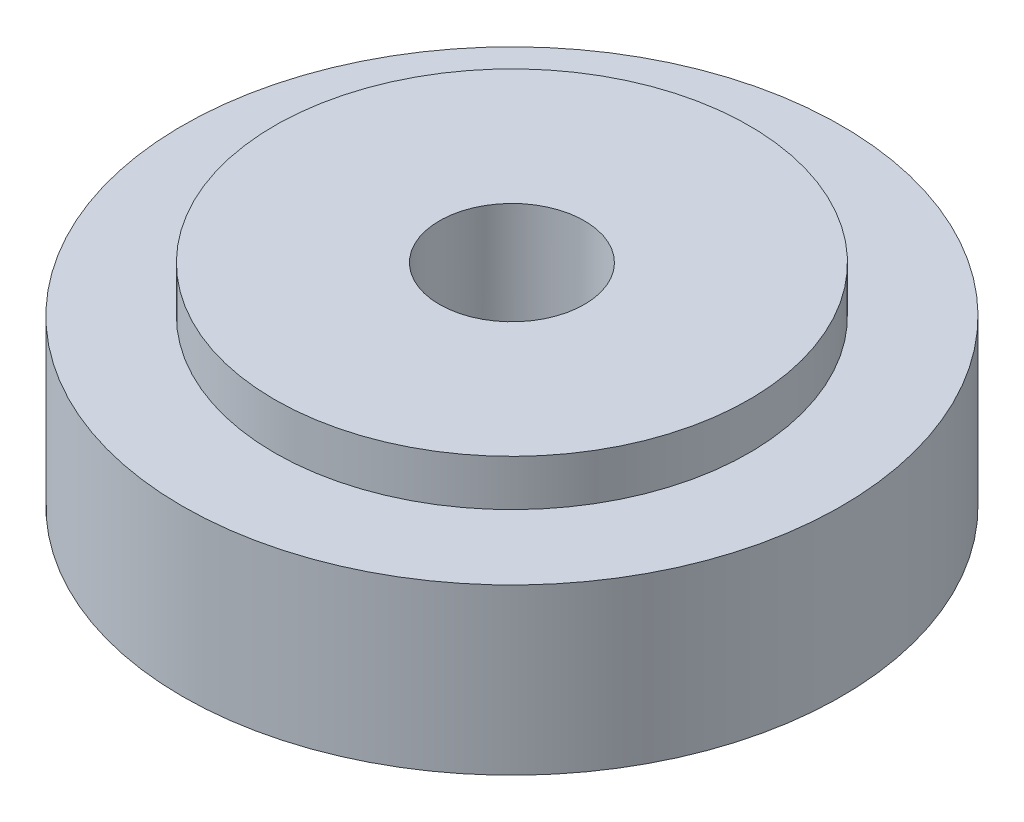
ISO-10303-21;
HEADER;
FILE_DESCRIPTION(('STEP AP214'),'2;1');
FILE_NAME('part.step','',(''),(''),'','','');
FILE_SCHEMA(('AUTOMOTIVE_DESIGN { 1 0 10303 214 1 1 1 1 }'));
ENDSEC;
DATA;
#1=APPLICATION_CONTEXT('core data for automotive mechanical design processes');
#2=APPLICATION_PROTOCOL_DEFINITION('international standard','automotive_design',2000,#1);
#3=PRODUCT_CONTEXT('',#1,'mechanical');
#4=PRODUCT('Part','Part','',(#3));
#5=PRODUCT_RELATED_PRODUCT_CATEGORY('part','',(#4));
#6=PRODUCT_DEFINITION_FORMATION('','',#4);
#7=PRODUCT_DEFINITION_CONTEXT('part definition',#1,'design');
#8=PRODUCT_DEFINITION('design','',#6,#7);
#9=PRODUCT_DEFINITION_SHAPE('','',#8);
#10=(LENGTH_UNIT() NAMED_UNIT(*) SI_UNIT(.MILLI.,.METRE.));
#11=(NAMED_UNIT(*) PLANE_ANGLE_UNIT() SI_UNIT($,.RADIAN.));
#12=(NAMED_UNIT(*) SI_UNIT($,.STERADIAN.) SOLID_ANGLE_UNIT());
#13=UNCERTAINTY_MEASURE_WITH_UNIT(LENGTH_MEASURE(1.E-05),#10,'distance_accuracy_value','');
#14=(GEOMETRIC_REPRESENTATION_CONTEXT(3) GLOBAL_UNCERTAINTY_ASSIGNED_CONTEXT((#13)) GLOBAL_UNIT_ASSIGNED_CONTEXT((#10,
#11,#12)) REPRESENTATION_CONTEXT('',''));
#15=CARTESIAN_POINT('',(0.,0.,0.));
#16=DIRECTION('',(0.,0.,1.));
#17=DIRECTION('',(1.,0.,0.));
#18=AXIS2_PLACEMENT_3D('',#15,#16,#17);
#19=CARTESIAN_POINT('',(0.,0.,0.));
#20=DIRECTION('',(0.,1.,0.));
#21=DIRECTION('',(0.,0.,1.));
#22=AXIS2_PLACEMENT_3D('',#19,#20,#21);
#23=CYLINDRICAL_SURFACE('',#22,1.1);
#24=CARTESIAN_POINT('',(0.,3.2,0.));
#25=DIRECTION('',(0.,1.,0.));
#26=DIRECTION('',(0.,0.,1.));
#27=AXIS2_PLACEMENT_3D('',#24,#25,#26);
#28=CIRCLE('',#27,1.1);
#29=CARTESIAN_POINT('',(0.,3.2,1.1));
#30=VERTEX_POINT('',#29);
#31=EDGE_CURVE('E55',#30,#30,#28,.T.);
#32=ORIENTED_EDGE('',*,*,#31,.T.);
#33=EDGE_LOOP('',(#32));
#34=FACE_BOUND('',#33,.T.);
#35=CARTESIAN_POINT('',(0.,1.,0.));
#36=DIRECTION('',(0.,-1.,0.));
#37=DIRECTION('',(0.,0.,-1.));
#38=AXIS2_PLACEMENT_3D('',#35,#36,#37);
#39=CIRCLE('',#38,1.1);
#40=CARTESIAN_POINT('',(0.,1.,-1.1));
#41=VERTEX_POINT('',#40);
#42=EDGE_CURVE('E37',#41,#41,#39,.F.);
#43=ORIENTED_EDGE('',*,*,#42,.F.);
#44=EDGE_LOOP('',(#43));
#45=FACE_BOUND('',#44,.T.);
#46=ADVANCED_FACE('F33',(#34,#45),#23,.F.);
#47=CARTESIAN_POINT('',(0.,2.5,0.));
#48=DIRECTION('',(0.,-1.,0.));
#49=DIRECTION('',(0.,0.,-1.));
#50=AXIS2_PLACEMENT_3D('',#47,#48,#49);
#51=CYLINDRICAL_SURFACE('',#50,5.);
#52=CARTESIAN_POINT('',(0.,2.5,0.));
#53=DIRECTION('',(0.,1.,0.));
#54=DIRECTION('',(0.,0.,1.));
#55=AXIS2_PLACEMENT_3D('',#52,#53,#54);
#56=CIRCLE('',#55,5.);
#57=CARTESIAN_POINT('',(0.,2.5,5.));
#58=VERTEX_POINT('',#57);
#59=EDGE_CURVE('E41',#58,#58,#56,.T.);
#60=ORIENTED_EDGE('',*,*,#59,.F.);
#61=EDGE_LOOP('',(#60));
#62=FACE_BOUND('',#61,.T.);
#63=CARTESIAN_POINT('',(0.,0.,0.));
#64=DIRECTION('',(0.,1.,0.));
#65=DIRECTION('',(0.,0.,1.));
#66=AXIS2_PLACEMENT_3D('',#63,#64,#65);
#67=CIRCLE('',#66,5.);
#68=CARTESIAN_POINT('',(0.,0.,5.));
#69=VERTEX_POINT('',#68);
#70=EDGE_CURVE('E46',#69,#69,#67,.T.);
#71=ORIENTED_EDGE('',*,*,#70,.T.);
#72=EDGE_LOOP('',(#71));
#73=FACE_BOUND('',#72,.T.);
#74=ADVANCED_FACE('F35',(#62,#73),#51,.T.);
#75=CARTESIAN_POINT('',(0.,2.5,0.));
#76=DIRECTION('',(0.,1.,0.));
#77=DIRECTION('',(0.,0.,1.));
#78=AXIS2_PLACEMENT_3D('',#75,#76,#77);
#79=PLANE('',#78);
#80=CARTESIAN_POINT('',(0.,2.5,0.));
#81=DIRECTION('',(0.,1.,0.));
#82=DIRECTION('',(0.,0.,1.));
#83=AXIS2_PLACEMENT_3D('',#80,#81,#82);
#84=CIRCLE('',#83,3.6);
#85=CARTESIAN_POINT('',(0.,2.5,3.6));
#86=VERTEX_POINT('',#85);
#87=EDGE_CURVE('E10',#86,#86,#84,.T.);
#88=ORIENTED_EDGE('',*,*,#87,.F.);
#89=EDGE_LOOP('',(#88));
#90=FACE_BOUND('',#89,.T.);
#91=ORIENTED_EDGE('',*,*,#59,.T.);
#92=EDGE_LOOP('',(#91));
#93=FACE_BOUND('',#92,.T.);
#94=ADVANCED_FACE('F83',(#90,#93),#79,.T.);
#95=CARTESIAN_POINT('',(0.,0.,0.));
#96=DIRECTION('',(0.,1.,0.));
#97=DIRECTION('',(0.,0.,1.));
#98=AXIS2_PLACEMENT_3D('',#95,#96,#97);
#99=PLANE('',#98);
#100=CARTESIAN_POINT('',(0.,0.,0.));
#101=DIRECTION('',(0.,-1.,0.));
#102=DIRECTION('',(0.,0.,-1.));
#103=AXIS2_PLACEMENT_3D('',#100,#101,#102);
#104=CIRCLE('',#103,1.9);
#105=CARTESIAN_POINT('',(0.,0.,-1.9));
#106=VERTEX_POINT('',#105);
#107=EDGE_CURVE('E64',#106,#106,#104,.T.);
#108=ORIENTED_EDGE('',*,*,#107,.F.);
#109=EDGE_LOOP('',(#108));
#110=FACE_BOUND('',#109,.T.);
#111=ORIENTED_EDGE('',*,*,#70,.F.);
#112=EDGE_LOOP('',(#111));
#113=FACE_BOUND('',#112,.T.);
#114=ADVANCED_FACE('F79',(#110,#113),#99,.F.);
#115=CARTESIAN_POINT('',(0.,3.2,0.));
#116=DIRECTION('',(0.,-1.,0.));
#117=DIRECTION('',(0.,0.,-1.));
#118=AXIS2_PLACEMENT_3D('',#115,#116,#117);
#119=CYLINDRICAL_SURFACE('',#118,3.6);
#120=CARTESIAN_POINT('',(0.,3.2,0.));
#121=DIRECTION('',(0.,1.,0.));
#122=DIRECTION('',(0.,0.,1.));
#123=AXIS2_PLACEMENT_3D('',#120,#121,#122);
#124=CIRCLE('',#123,3.6);
#125=CARTESIAN_POINT('',(0.,3.2,3.6));
#126=VERTEX_POINT('',#125);
#127=EDGE_CURVE('E49',#126,#126,#124,.T.);
#128=ORIENTED_EDGE('',*,*,#127,.F.);
#129=EDGE_LOOP('',(#128));
#130=FACE_BOUND('',#129,.T.);
#131=ORIENTED_EDGE('',*,*,#87,.T.);
#132=EDGE_LOOP('',(#131));
#133=FACE_BOUND('',#132,.T.);
#134=ADVANCED_FACE('F82',(#130,#133),#119,.T.);
#135=CARTESIAN_POINT('',(0.,3.2,0.));
#136=DIRECTION('',(0.,1.,0.));
#137=DIRECTION('',(0.,0.,1.));
#138=AXIS2_PLACEMENT_3D('',#135,#136,#137);
#139=PLANE('',#138);
#140=ORIENTED_EDGE('',*,*,#31,.F.);
#141=EDGE_LOOP('',(#140));
#142=FACE_BOUND('',#141,.T.);
#143=ORIENTED_EDGE('',*,*,#127,.T.);
#144=EDGE_LOOP('',(#143));
#145=FACE_BOUND('',#144,.T.);
#146=ADVANCED_FACE('F89',(#142,#145),#139,.T.);
#147=CARTESIAN_POINT('',(0.,1.,0.));
#148=DIRECTION('',(0.,-1.,0.));
#149=DIRECTION('',(0.,0.,-1.));
#150=AXIS2_PLACEMENT_3D('',#147,#148,#149);
#151=PLANE('',#150);
#152=CARTESIAN_POINT('',(0.,1.,0.));
#153=DIRECTION('',(0.,-1.,0.));
#154=DIRECTION('',(0.,0.,-1.));
#155=AXIS2_PLACEMENT_3D('',#152,#153,#154);
#156=CIRCLE('',#155,1.9);
#157=CARTESIAN_POINT('',(0.,1.,-1.9));
#158=VERTEX_POINT('',#157);
#159=EDGE_CURVE('E62',#158,#158,#156,.T.);
#160=ORIENTED_EDGE('',*,*,#159,.T.);
#161=EDGE_LOOP('',(#160));
#162=FACE_BOUND('',#161,.T.);
#163=ORIENTED_EDGE('',*,*,#42,.T.);
#164=EDGE_LOOP('',(#163));
#165=FACE_BOUND('',#164,.T.);
#166=ADVANCED_FACE('F70',(#162,#165),#151,.T.);
#167=CARTESIAN_POINT('',(0.,1.,0.));
#168=DIRECTION('',(0.,-1.,0.));
#169=DIRECTION('',(0.,0.,-1.));
#170=AXIS2_PLACEMENT_3D('',#167,#168,#169);
#171=CYLINDRICAL_SURFACE('',#170,1.9);
#172=ORIENTED_EDGE('',*,*,#159,.F.);
#173=EDGE_LOOP('',(#172));
#174=FACE_BOUND('',#173,.T.);
#175=ORIENTED_EDGE('',*,*,#107,.T.);
#176=EDGE_LOOP('',(#175));
#177=FACE_BOUND('',#176,.T.);
#178=ADVANCED_FACE('F73',(#174,#177),#171,.F.);
#179=CLOSED_SHELL('',(#46,#74,#94,#114,#134,#146,#166,#178));
#180=MANIFOLD_SOLID_BREP('B2',#179);
#181=ADVANCED_BREP_SHAPE_REPRESENTATION('',(#18,#180),#14);
#182=SHAPE_DEFINITION_REPRESENTATION(#9,#181);
ENDSEC;
END-ISO-10303-21;
